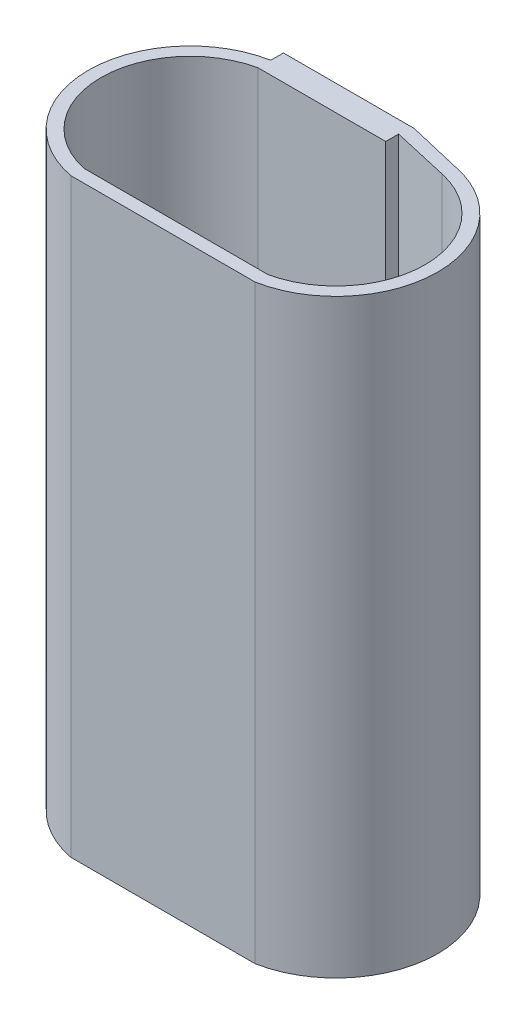
ISO-10303-21;
HEADER;
FILE_DESCRIPTION(('STEP AP214'),'2;1');
FILE_NAME('part.step','',(''),(''),'','','');
FILE_SCHEMA(('AUTOMOTIVE_DESIGN { 1 0 10303 214 1 1 1 1 }'));
ENDSEC;
DATA;
#1=APPLICATION_CONTEXT('core data for automotive mechanical design processes');
#2=APPLICATION_PROTOCOL_DEFINITION('international standard','automotive_design',2000,#1);
#3=PRODUCT_CONTEXT('',#1,'mechanical');
#4=PRODUCT('Part','Part','',(#3));
#5=PRODUCT_RELATED_PRODUCT_CATEGORY('part','',(#4));
#6=PRODUCT_DEFINITION_FORMATION('','',#4);
#7=PRODUCT_DEFINITION_CONTEXT('part definition',#1,'design');
#8=PRODUCT_DEFINITION('design','',#6,#7);
#9=PRODUCT_DEFINITION_SHAPE('','',#8);
#10=(LENGTH_UNIT() NAMED_UNIT(*) SI_UNIT(.MILLI.,.METRE.));
#11=(NAMED_UNIT(*) PLANE_ANGLE_UNIT() SI_UNIT($,.RADIAN.));
#12=(NAMED_UNIT(*) SI_UNIT($,.STERADIAN.) SOLID_ANGLE_UNIT());
#13=UNCERTAINTY_MEASURE_WITH_UNIT(LENGTH_MEASURE(1.E-05),#10,'distance_accuracy_value','');
#14=(GEOMETRIC_REPRESENTATION_CONTEXT(3) GLOBAL_UNCERTAINTY_ASSIGNED_CONTEXT((#13)) GLOBAL_UNIT_ASSIGNED_CONTEXT((#10,
#11,#12)) REPRESENTATION_CONTEXT('',''));
#15=CARTESIAN_POINT('',(0.,0.,0.));
#16=DIRECTION('',(0.,0.,1.));
#17=DIRECTION('',(1.,0.,0.));
#18=AXIS2_PLACEMENT_3D('',#15,#16,#17);
#19=CARTESIAN_POINT('',(0.,70.45,11.9295416164526));
#20=DIRECTION('',(0.,0.,-1.));
#21=DIRECTION('',(-1.,0.,0.));
#22=AXIS2_PLACEMENT_3D('',#19,#20,#21);
#23=PLANE('',#22);
#24=DIRECTION('',(1.,0.,0.));
#25=VECTOR('',#24,1.);
#26=CARTESIAN_POINT('',(0.,0.,11.9295416164526));
#27=LINE('',#26,#25);
#28=CARTESIAN_POINT('',(-10.463385514887,0.,11.9295416164526));
#29=VERTEX_POINT('',#28);
#30=CARTESIAN_POINT('',(11.536614485113,0.,11.9295416164526));
#31=VERTEX_POINT('',#30);
#32=EDGE_CURVE('E174',#29,#31,#27,.T.);
#33=ORIENTED_EDGE('',*,*,#32,.T.);
#34=DIRECTION('',(0.,-1.,0.));
#35=VECTOR('',#34,1.);
#36=CARTESIAN_POINT('',(11.536614485113,70.45,11.9295416164526));
#37=LINE('',#36,#35);
#38=CARTESIAN_POINT('',(11.536614485113,70.45,11.9295416164526));
#39=VERTEX_POINT('',#38);
#40=EDGE_CURVE('E193',#39,#31,#37,.T.);
#41=ORIENTED_EDGE('',*,*,#40,.F.);
#42=DIRECTION('',(1.,0.,0.));
#43=VECTOR('',#42,1.);
#44=CARTESIAN_POINT('',(0.,70.45,11.9295416164526));
#45=LINE('',#44,#43);
#46=CARTESIAN_POINT('',(-10.463385514887,70.45,11.9295416164526));
#47=VERTEX_POINT('',#46);
#48=EDGE_CURVE('E281',#47,#39,#45,.T.);
#49=ORIENTED_EDGE('',*,*,#48,.F.);
#50=DIRECTION('',(0.,-1.,0.));
#51=VECTOR('',#50,1.);
#52=CARTESIAN_POINT('',(-10.463385514887,70.45,11.9295416164526));
#53=LINE('',#52,#51);
#54=EDGE_CURVE('E186',#47,#29,#53,.T.);
#55=ORIENTED_EDGE('',*,*,#54,.T.);
#56=EDGE_LOOP('',(#33,#41,#49,#55));
#57=FACE_BOUND('',#56,.T.);
#58=ADVANCED_FACE('F34',(#57),#23,.F.);
#59=CARTESIAN_POINT('',(9.24161448511298,70.45,0.));
#60=DIRECTION('',(0.,-1.,0.));
#61=DIRECTION('',(0.,0.,-1.));
#62=AXIS2_PLACEMENT_3D('',#59,#60,#61);
#63=CYLINDRICAL_SURFACE('',#62,12.1482915744838);
#64=CARTESIAN_POINT('',(9.24161448511298,0.,0.));
#65=DIRECTION('',(0.,1.,0.));
#66=DIRECTION('',(0.,0.,1.));
#67=AXIS2_PLACEMENT_3D('',#64,#65,#66);
#68=CIRCLE('',#67,12.1482915744838);
#69=CARTESIAN_POINT('',(11.536614485113,0.,-11.9295416164526));
#70=VERTEX_POINT('',#69);
#71=EDGE_CURVE('E177',#31,#70,#68,.T.);
#72=ORIENTED_EDGE('',*,*,#71,.T.);
#73=DIRECTION('',(0.,-1.,0.));
#74=VECTOR('',#73,1.);
#75=CARTESIAN_POINT('',(11.536614485113,70.45,-11.9295416164526));
#76=LINE('',#75,#74);
#77=CARTESIAN_POINT('',(11.536614485113,70.45,-11.9295416164526));
#78=VERTEX_POINT('',#77);
#79=EDGE_CURVE('E191',#78,#70,#76,.T.);
#80=ORIENTED_EDGE('',*,*,#79,.F.);
#81=CARTESIAN_POINT('',(9.24161448511298,70.45,0.));
#82=DIRECTION('',(0.,1.,0.));
#83=DIRECTION('',(0.,0.,1.));
#84=AXIS2_PLACEMENT_3D('',#81,#82,#83);
#85=CIRCLE('',#84,12.1482915744838);
#86=EDGE_CURVE('E152',#39,#78,#85,.T.);
#87=ORIENTED_EDGE('',*,*,#86,.F.);
#88=ORIENTED_EDGE('',*,*,#40,.T.);
#89=EDGE_LOOP('',(#72,#80,#87,#88));
#90=FACE_BOUND('',#89,.T.);
#91=ADVANCED_FACE('F227',(#90),#63,.T.);
#92=CARTESIAN_POINT('',(3.26790151277206,70.45,-13.8767762699066));
#93=DIRECTION('',(0.229223946718848,0.,-0.97337371150583));
#94=DIRECTION('',(-0.97337371150583,0.,-0.229223946718849));
#95=AXIS2_PLACEMENT_3D('',#92,#93,#94);
#96=PLANE('',#95);
#97=DIRECTION('',(0.97337371150583,0.,0.229223946718849));
#98=VECTOR('',#97,1.);
#99=CARTESIAN_POINT('',(3.26790151277206,0.,-13.8767762699066));
#100=LINE('',#99,#98);
#101=CARTESIAN_POINT('',(5.13292491256806,0.,-13.4375739169245));
#102=VERTEX_POINT('',#101);
#103=EDGE_CURVE('E180',#102,#70,#100,.T.);
#104=ORIENTED_EDGE('',*,*,#103,.F.);
#105=DIRECTION('',(0.,-1.,0.));
#106=VECTOR('',#105,1.);
#107=CARTESIAN_POINT('',(5.13292491256806,70.45,-13.4375739169245));
#108=LINE('',#107,#106);
#109=CARTESIAN_POINT('',(5.13292491256806,70.45,-13.4375739169245));
#110=VERTEX_POINT('',#109);
#111=EDGE_CURVE('E141',#110,#102,#108,.T.);
#112=ORIENTED_EDGE('',*,*,#111,.F.);
#113=DIRECTION('',(0.97337371150583,0.,0.229223946718849));
#114=VECTOR('',#113,1.);
#115=CARTESIAN_POINT('',(3.26790151277206,70.45,-13.8767762699066));
#116=LINE('',#115,#114);
#117=EDGE_CURVE('E150',#110,#78,#116,.T.);
#118=ORIENTED_EDGE('',*,*,#117,.T.);
#119=ORIENTED_EDGE('',*,*,#79,.T.);
#120=EDGE_LOOP('',(#104,#112,#118,#119));
#121=FACE_BOUND('',#120,.T.);
#122=ADVANCED_FACE('F222',(#121),#96,.T.);
#123=CARTESIAN_POINT('',(0.,70.45,-13.4375739169245));
#124=DIRECTION('',(0.,0.,-1.));
#125=DIRECTION('',(-1.,0.,0.));
#126=AXIS2_PLACEMENT_3D('',#123,#124,#125);
#127=PLANE('',#126);
#128=DIRECTION('',(1.,0.,0.));
#129=VECTOR('',#128,1.);
#130=CARTESIAN_POINT('',(0.,0.,-13.4375739169245));
#131=LINE('',#130,#129);
#132=CARTESIAN_POINT('',(-10.463385514887,0.,-13.4375739169245));
#133=VERTEX_POINT('',#132);
#134=EDGE_CURVE('E140',#133,#102,#131,.T.);
#135=ORIENTED_EDGE('',*,*,#134,.F.);
#136=DIRECTION('',(0.,-1.,0.));
#137=VECTOR('',#136,1.);
#138=CARTESIAN_POINT('',(-10.463385514887,70.45,-13.4375739169245));
#139=LINE('',#138,#137);
#140=CARTESIAN_POINT('',(-10.463385514887,70.45,-13.4375739169245));
#141=VERTEX_POINT('',#140);
#142=EDGE_CURVE('E134',#141,#133,#139,.T.);
#143=ORIENTED_EDGE('',*,*,#142,.F.);
#144=DIRECTION('',(1.,0.,0.));
#145=VECTOR('',#144,1.);
#146=CARTESIAN_POINT('',(0.,70.45,-13.4375739169245));
#147=LINE('',#146,#145);
#148=EDGE_CURVE('E138',#141,#110,#147,.T.);
#149=ORIENTED_EDGE('',*,*,#148,.T.);
#150=ORIENTED_EDGE('',*,*,#111,.T.);
#151=EDGE_LOOP('',(#135,#143,#149,#150));
#152=FACE_BOUND('',#151,.T.);
#153=ADVANCED_FACE('F136',(#152),#127,.T.);
#154=CARTESIAN_POINT('',(-10.463385514887,70.45,0.));
#155=DIRECTION('',(1.,0.,0.));
#156=DIRECTION('',(0.,0.,-1.));
#157=AXIS2_PLACEMENT_3D('',#154,#155,#156);
#158=PLANE('',#157);
#159=CARTESIAN_POINT('',(-10.463385514887,36.4422418848818,-12.6819068964044));
#160=DIRECTION('',(1.,0.,0.));
#161=DIRECTION('',(0.,0.,-1.));
#162=AXIS2_PLACEMENT_3D('',#159,#160,#161);
#163=CIRCLE('',#162,0.572709313377236);
#164=CARTESIAN_POINT('',(-10.463385514887,36.4422418848818,-13.2546162097816));
#165=VERTEX_POINT('',#164);
#166=EDGE_CURVE('E11',#165,#165,#163,.F.);
#167=ORIENTED_EDGE('',*,*,#166,.F.);
#168=EDGE_LOOP('',(#167));
#169=FACE_BOUND('',#168,.T.);
#170=CARTESIAN_POINT('',(-10.463385514887,34.0138853527279,-12.6819068964044));
#171=DIRECTION('',(1.,0.,0.));
#172=DIRECTION('',(0.,0.,-1.));
#173=AXIS2_PLACEMENT_3D('',#170,#171,#172);
#174=CIRCLE('',#173,0.574746223115068);
#175=CARTESIAN_POINT('',(-10.463385514887,34.0138853527279,-13.2566531195195));
#176=VERTEX_POINT('',#175);
#177=EDGE_CURVE('E43',#176,#176,#174,.F.);
#178=ORIENTED_EDGE('',*,*,#177,.F.);
#179=EDGE_LOOP('',(#178));
#180=FACE_BOUND('',#179,.T.);
#181=DIRECTION('',(0.,0.,1.));
#182=VECTOR('',#181,1.);
#183=CARTESIAN_POINT('',(-10.463385514887,0.,0.));
#184=LINE('',#183,#182);
#185=CARTESIAN_POINT('',(-10.463385514887,0.,-11.9295416164526));
#186=VERTEX_POINT('',#185);
#187=EDGE_CURVE('E91',#133,#186,#184,.T.);
#188=ORIENTED_EDGE('',*,*,#187,.T.);
#189=DIRECTION('',(0.,-1.,0.));
#190=VECTOR('',#189,1.);
#191=CARTESIAN_POINT('',(-10.463385514887,70.45,-11.9295416164526));
#192=LINE('',#191,#190);
#193=CARTESIAN_POINT('',(-10.463385514887,70.45,-11.9295416164526));
#194=VERTEX_POINT('',#193);
#195=EDGE_CURVE('E142',#194,#186,#192,.T.);
#196=ORIENTED_EDGE('',*,*,#195,.F.);
#197=DIRECTION('',(0.,0.,1.));
#198=VECTOR('',#197,1.);
#199=CARTESIAN_POINT('',(-10.463385514887,70.45,0.));
#200=LINE('',#199,#198);
#201=EDGE_CURVE('E144',#141,#194,#200,.T.);
#202=ORIENTED_EDGE('',*,*,#201,.F.);
#203=ORIENTED_EDGE('',*,*,#142,.T.);
#204=EDGE_LOOP('',(#188,#196,#202,#203));
#205=FACE_BOUND('',#204,.T.);
#206=ADVANCED_FACE('F145',(#169,#180,#205),#158,.F.);
#207=CARTESIAN_POINT('',(4.78876070588704,70.45,0.));
#208=DIRECTION('',(-1.,0.,0.));
#209=DIRECTION('',(0.,0.,1.));
#210=AXIS2_PLACEMENT_3D('',#207,#208,#209);
#211=PLANE('',#210);
#212=DIRECTION('',(0.,0.,-1.));
#213=VECTOR('',#212,1.);
#214=CARTESIAN_POINT('',(4.78876070588704,0.,0.));
#215=LINE('',#214,#213);
#216=CARTESIAN_POINT('',(4.78876070588704,0.,-10.3895416164526));
#217=VERTEX_POINT('',#216);
#218=CARTESIAN_POINT('',(4.78876070588704,0.,-11.9295416164526));
#219=VERTEX_POINT('',#218);
#220=EDGE_CURVE('E158',#217,#219,#215,.T.);
#221=ORIENTED_EDGE('',*,*,#220,.T.);
#222=DIRECTION('',(0.,-1.,0.));
#223=VECTOR('',#222,1.);
#224=CARTESIAN_POINT('',(4.78876070588704,70.45,-11.9295416164526));
#225=LINE('',#224,#223);
#226=CARTESIAN_POINT('',(4.78876070588704,70.45,-11.9295416164526));
#227=VERTEX_POINT('',#226);
#228=EDGE_CURVE('E188',#227,#219,#225,.T.);
#229=ORIENTED_EDGE('',*,*,#228,.F.);
#230=DIRECTION('',(0.,0.,-1.));
#231=VECTOR('',#230,1.);
#232=CARTESIAN_POINT('',(4.78876070588704,70.45,0.));
#233=LINE('',#232,#231);
#234=CARTESIAN_POINT('',(4.78876070588704,70.45,-10.3895416164526));
#235=VERTEX_POINT('',#234);
#236=EDGE_CURVE('E106',#235,#227,#233,.T.);
#237=ORIENTED_EDGE('',*,*,#236,.F.);
#238=DIRECTION('',(0.,-1.,0.));
#239=VECTOR('',#238,1.);
#240=CARTESIAN_POINT('',(4.78876070588704,70.45,-10.3895416164526));
#241=LINE('',#240,#239);
#242=EDGE_CURVE('E157',#235,#217,#241,.T.);
#243=ORIENTED_EDGE('',*,*,#242,.T.);
#244=EDGE_LOOP('',(#221,#229,#237,#243));
#245=FACE_BOUND('',#244,.T.);
#246=ADVANCED_FACE('F36',(#245),#211,.F.);
#247=CARTESIAN_POINT('',(2.82485777500252,70.45,-12.3777449433938));
#248=DIRECTION('',(-0.222499841773163,0.,0.974932726094943));
#249=DIRECTION('',(0.974932726094943,0.,0.222499841773163));
#250=AXIS2_PLACEMENT_3D('',#247,#248,#249);
#251=PLANE('',#250);
#252=DIRECTION('',(-0.974932726094943,0.,-0.222499841773163));
#253=VECTOR('',#252,1.);
#254=CARTESIAN_POINT('',(2.82485777500252,0.,-12.3777449433938));
#255=LINE('',#254,#253);
#256=CARTESIAN_POINT('',(11.536614485113,0.,-10.3895416164526));
#257=VERTEX_POINT('',#256);
#258=EDGE_CURVE('E161',#257,#219,#255,.T.);
#259=ORIENTED_EDGE('',*,*,#258,.F.);
#260=DIRECTION('',(0.,-1.,0.));
#261=VECTOR('',#260,1.);
#262=CARTESIAN_POINT('',(11.536614485113,70.45,-10.3895416164526));
#263=LINE('',#262,#261);
#264=CARTESIAN_POINT('',(11.536614485113,70.45,-10.3895416164526));
#265=VERTEX_POINT('',#264);
#266=EDGE_CURVE('E206',#265,#257,#263,.T.);
#267=ORIENTED_EDGE('',*,*,#266,.F.);
#268=DIRECTION('',(-0.974932726094943,0.,-0.222499841773163));
#269=VECTOR('',#268,1.);
#270=CARTESIAN_POINT('',(2.82485777500252,70.45,-12.3777449433938));
#271=LINE('',#270,#269);
#272=EDGE_CURVE('E271',#265,#227,#271,.T.);
#273=ORIENTED_EDGE('',*,*,#272,.T.);
#274=ORIENTED_EDGE('',*,*,#228,.T.);
#275=EDGE_LOOP('',(#259,#267,#273,#274));
#276=FACE_BOUND('',#275,.T.);
#277=ADVANCED_FACE('F220',(#276),#251,.T.);
#278=CARTESIAN_POINT('',(9.24161448511298,70.45,0.));
#279=DIRECTION('',(0.,-1.,0.));
#280=DIRECTION('',(0.,0.,-1.));
#281=AXIS2_PLACEMENT_3D('',#278,#279,#280);
#282=CYLINDRICAL_SURFACE('',#281,10.64);
#283=CARTESIAN_POINT('',(9.24161448511298,0.,0.));
#284=DIRECTION('',(0.,1.,0.));
#285=DIRECTION('',(0.,0.,1.));
#286=AXIS2_PLACEMENT_3D('',#283,#284,#285);
#287=CIRCLE('',#286,10.64);
#288=CARTESIAN_POINT('',(11.536614485113,0.,10.3895416164526));
#289=VERTEX_POINT('',#288);
#290=EDGE_CURVE('E165',#289,#257,#287,.T.);
#291=ORIENTED_EDGE('',*,*,#290,.F.);
#292=DIRECTION('',(0.,-1.,0.));
#293=VECTOR('',#292,1.);
#294=CARTESIAN_POINT('',(11.536614485113,70.45,10.3895416164526));
#295=LINE('',#294,#293);
#296=CARTESIAN_POINT('',(11.536614485113,70.45,10.3895416164526));
#297=VERTEX_POINT('',#296);
#298=EDGE_CURVE('E204',#297,#289,#295,.T.);
#299=ORIENTED_EDGE('',*,*,#298,.F.);
#300=CARTESIAN_POINT('',(9.24161448511298,70.45,0.));
#301=DIRECTION('',(0.,1.,0.));
#302=DIRECTION('',(0.,0.,1.));
#303=AXIS2_PLACEMENT_3D('',#300,#301,#302);
#304=CIRCLE('',#303,10.64);
#305=EDGE_CURVE('E269',#297,#265,#304,.T.);
#306=ORIENTED_EDGE('',*,*,#305,.T.);
#307=ORIENTED_EDGE('',*,*,#266,.T.);
#308=EDGE_LOOP('',(#291,#299,#306,#307));
#309=FACE_BOUND('',#308,.T.);
#310=ADVANCED_FACE('F249',(#309),#282,.F.);
#311=CARTESIAN_POINT('',(0.,70.45,10.3895416164526));
#312=DIRECTION('',(0.,0.,1.));
#313=DIRECTION('',(1.,0.,0.));
#314=AXIS2_PLACEMENT_3D('',#311,#312,#313);
#315=PLANE('',#314);
#316=DIRECTION('',(-1.,0.,0.));
#317=VECTOR('',#316,1.);
#318=CARTESIAN_POINT('',(0.,0.,10.3895416164526));
#319=LINE('',#318,#317);
#320=CARTESIAN_POINT('',(-10.463385514887,0.,10.3895416164526));
#321=VERTEX_POINT('',#320);
#322=EDGE_CURVE('E168',#289,#321,#319,.T.);
#323=ORIENTED_EDGE('',*,*,#322,.T.);
#324=DIRECTION('',(0.,-1.,0.));
#325=VECTOR('',#324,1.);
#326=CARTESIAN_POINT('',(-10.463385514887,70.45,10.3895416164526));
#327=LINE('',#326,#325);
#328=CARTESIAN_POINT('',(-10.463385514887,70.45,10.3895416164526));
#329=VERTEX_POINT('',#328);
#330=EDGE_CURVE('E201',#329,#321,#327,.T.);
#331=ORIENTED_EDGE('',*,*,#330,.F.);
#332=DIRECTION('',(-1.,0.,0.));
#333=VECTOR('',#332,1.);
#334=CARTESIAN_POINT('',(0.,70.45,10.3895416164526));
#335=LINE('',#334,#333);
#336=EDGE_CURVE('E270',#297,#329,#335,.T.);
#337=ORIENTED_EDGE('',*,*,#336,.F.);
#338=ORIENTED_EDGE('',*,*,#298,.T.);
#339=EDGE_LOOP('',(#323,#331,#337,#338));
#340=FACE_BOUND('',#339,.T.);
#341=ADVANCED_FACE('F245',(#340),#315,.F.);
#342=CARTESIAN_POINT('',(-8.16838551488702,70.45,0.));
#343=DIRECTION('',(0.,-1.,0.));
#344=DIRECTION('',(0.,0.,-1.));
#345=AXIS2_PLACEMENT_3D('',#342,#343,#344);
#346=CYLINDRICAL_SURFACE('',#345,10.64);
#347=CARTESIAN_POINT('',(-8.16838551488702,0.,0.));
#348=DIRECTION('',(0.,1.,0.));
#349=DIRECTION('',(0.,0.,1.));
#350=AXIS2_PLACEMENT_3D('',#347,#348,#349);
#351=CIRCLE('',#350,10.64);
#352=CARTESIAN_POINT('',(-10.463385514887,0.,-10.3895416164526));
#353=VERTEX_POINT('',#352);
#354=EDGE_CURVE('E170',#321,#353,#351,.F.);
#355=ORIENTED_EDGE('',*,*,#354,.T.);
#356=DIRECTION('',(0.,-1.,0.));
#357=VECTOR('',#356,1.);
#358=CARTESIAN_POINT('',(-10.463385514887,70.45,-10.3895416164526));
#359=LINE('',#358,#357);
#360=CARTESIAN_POINT('',(-10.463385514887,70.45,-10.3895416164526));
#361=VERTEX_POINT('',#360);
#362=EDGE_CURVE('E198',#361,#353,#359,.T.);
#363=ORIENTED_EDGE('',*,*,#362,.F.);
#364=CARTESIAN_POINT('',(-8.16838551488702,70.45,0.));
#365=DIRECTION('',(0.,1.,0.));
#366=DIRECTION('',(0.,0.,1.));
#367=AXIS2_PLACEMENT_3D('',#364,#365,#366);
#368=CIRCLE('',#367,10.64);
#369=EDGE_CURVE('E273',#329,#361,#368,.F.);
#370=ORIENTED_EDGE('',*,*,#369,.F.);
#371=ORIENTED_EDGE('',*,*,#330,.T.);
#372=EDGE_LOOP('',(#355,#363,#370,#371));
#373=FACE_BOUND('',#372,.T.);
#374=ADVANCED_FACE('F241',(#373),#346,.F.);
#375=CARTESIAN_POINT('',(0.,70.45,-10.3895416164526));
#376=DIRECTION('',(0.,0.,-1.));
#377=DIRECTION('',(-1.,0.,0.));
#378=AXIS2_PLACEMENT_3D('',#375,#376,#377);
#379=PLANE('',#378);
#380=DIRECTION('',(1.,0.,0.));
#381=VECTOR('',#380,1.);
#382=CARTESIAN_POINT('',(0.,0.,-10.3895416164526));
#383=LINE('',#382,#381);
#384=EDGE_CURVE('E172',#353,#217,#383,.T.);
#385=ORIENTED_EDGE('',*,*,#384,.T.);
#386=ORIENTED_EDGE('',*,*,#242,.F.);
#387=DIRECTION('',(1.,0.,0.));
#388=VECTOR('',#387,1.);
#389=CARTESIAN_POINT('',(0.,70.45,-10.3895416164526));
#390=LINE('',#389,#388);
#391=EDGE_CURVE('E279',#361,#235,#390,.T.);
#392=ORIENTED_EDGE('',*,*,#391,.F.);
#393=ORIENTED_EDGE('',*,*,#362,.T.);
#394=EDGE_LOOP('',(#385,#386,#392,#393));
#395=FACE_BOUND('',#394,.T.);
#396=ADVANCED_FACE('F237',(#395),#379,.F.);
#397=CARTESIAN_POINT('',(-8.16838551488702,70.45,0.));
#398=DIRECTION('',(0.,-1.,0.));
#399=DIRECTION('',(0.,0.,-1.));
#400=AXIS2_PLACEMENT_3D('',#397,#398,#399);
#401=CYLINDRICAL_SURFACE('',#400,12.1482915744838);
#402=CARTESIAN_POINT('',(-8.16838551488702,0.,0.));
#403=DIRECTION('',(0.,1.,0.));
#404=DIRECTION('',(0.,0.,1.));
#405=AXIS2_PLACEMENT_3D('',#402,#403,#404);
#406=CIRCLE('',#405,12.1482915744838);
#407=EDGE_CURVE('E97',#186,#29,#406,.T.);
#408=ORIENTED_EDGE('',*,*,#407,.T.);
#409=ORIENTED_EDGE('',*,*,#54,.F.);
#410=CARTESIAN_POINT('',(-8.16838551488702,70.45,0.));
#411=DIRECTION('',(0.,1.,0.));
#412=DIRECTION('',(0.,0.,1.));
#413=AXIS2_PLACEMENT_3D('',#410,#411,#412);
#414=CIRCLE('',#413,12.1482915744838);
#415=EDGE_CURVE('E51',#194,#47,#414,.T.);
#416=ORIENTED_EDGE('',*,*,#415,.F.);
#417=ORIENTED_EDGE('',*,*,#195,.T.);
#418=EDGE_LOOP('',(#408,#409,#416,#417));
#419=FACE_BOUND('',#418,.T.);
#420=ADVANCED_FACE('F240',(#419),#401,.T.);
#421=CARTESIAN_POINT('',(0.,70.45,0.));
#422=DIRECTION('',(0.,1.,0.));
#423=DIRECTION('',(0.,0.,1.));
#424=AXIS2_PLACEMENT_3D('',#421,#422,#423);
#425=PLANE('',#424);
#426=ORIENTED_EDGE('',*,*,#236,.T.);
#427=ORIENTED_EDGE('',*,*,#272,.F.);
#428=ORIENTED_EDGE('',*,*,#305,.F.);
#429=ORIENTED_EDGE('',*,*,#336,.T.);
#430=ORIENTED_EDGE('',*,*,#369,.T.);
#431=ORIENTED_EDGE('',*,*,#391,.T.);
#432=EDGE_LOOP('',(#426,#427,#428,#429,#430,#431));
#433=FACE_BOUND('',#432,.T.);
#434=ORIENTED_EDGE('',*,*,#48,.T.);
#435=ORIENTED_EDGE('',*,*,#86,.T.);
#436=ORIENTED_EDGE('',*,*,#117,.F.);
#437=ORIENTED_EDGE('',*,*,#148,.F.);
#438=ORIENTED_EDGE('',*,*,#201,.T.);
#439=ORIENTED_EDGE('',*,*,#415,.T.);
#440=EDGE_LOOP('',(#434,#435,#436,#437,#438,#439));
#441=FACE_BOUND('',#440,.T.);
#442=ADVANCED_FACE('F148',(#433,#441),#425,.T.);
#443=CARTESIAN_POINT('',(0.,0.,0.));
#444=DIRECTION('',(0.,1.,0.));
#445=DIRECTION('',(0.,0.,1.));
#446=AXIS2_PLACEMENT_3D('',#443,#444,#445);
#447=PLANE('',#446);
#448=ORIENTED_EDGE('',*,*,#220,.F.);
#449=ORIENTED_EDGE('',*,*,#384,.F.);
#450=ORIENTED_EDGE('',*,*,#354,.F.);
#451=ORIENTED_EDGE('',*,*,#322,.F.);
#452=ORIENTED_EDGE('',*,*,#290,.T.);
#453=ORIENTED_EDGE('',*,*,#258,.T.);
#454=EDGE_LOOP('',(#448,#449,#450,#451,#452,#453));
#455=FACE_BOUND('',#454,.T.);
#456=ORIENTED_EDGE('',*,*,#32,.F.);
#457=ORIENTED_EDGE('',*,*,#407,.F.);
#458=ORIENTED_EDGE('',*,*,#187,.F.);
#459=ORIENTED_EDGE('',*,*,#134,.T.);
#460=ORIENTED_EDGE('',*,*,#103,.T.);
#461=ORIENTED_EDGE('',*,*,#71,.F.);
#462=EDGE_LOOP('',(#456,#457,#458,#459,#460,#461));
#463=FACE_BOUND('',#462,.T.);
#464=ADVANCED_FACE('F263',(#455,#463),#447,.F.);
#465=CARTESIAN_POINT('',(-12.463385514887,34.0138853527279,-12.6819068964044));
#466=DIRECTION('',(1.,0.,0.));
#467=DIRECTION('',(0.,0.,-1.));
#468=AXIS2_PLACEMENT_3D('',#465,#466,#467);
#469=CYLINDRICAL_SURFACE('',#468,0.574746223115068);
#470=CARTESIAN_POINT('',(-12.463385514887,34.0138853527279,-12.6819068964044));
#471=DIRECTION('',(-1.,0.,0.));
#472=DIRECTION('',(0.,0.,1.));
#473=AXIS2_PLACEMENT_3D('',#470,#471,#472);
#474=CIRCLE('',#473,0.574746223115068);
#475=CARTESIAN_POINT('',(-12.463385514887,34.0138853527279,-12.1071606732893));
#476=VERTEX_POINT('',#475);
#477=EDGE_CURVE('E162',#476,#476,#474,.T.);
#478=ORIENTED_EDGE('',*,*,#477,.F.);
#479=EDGE_LOOP('',(#478));
#480=FACE_BOUND('',#479,.T.);
#481=ORIENTED_EDGE('',*,*,#177,.T.);
#482=EDGE_LOOP('',(#481));
#483=FACE_BOUND('',#482,.T.);
#484=ADVANCED_FACE('F211',(#480,#483),#469,.T.);
#485=CARTESIAN_POINT('',(-12.463385514887,34.0138853527279,-12.6819068964044));
#486=DIRECTION('',(-1.,0.,0.));
#487=DIRECTION('',(0.,0.,1.));
#488=AXIS2_PLACEMENT_3D('',#485,#486,#487);
#489=PLANE('',#488);
#490=ORIENTED_EDGE('',*,*,#477,.T.);
#491=EDGE_LOOP('',(#490));
#492=FACE_BOUND('',#491,.T.);
#493=ADVANCED_FACE('F298',(#492),#489,.T.);
#494=CARTESIAN_POINT('',(-12.463385514887,36.4422418848818,-12.6819068964044));
#495=DIRECTION('',(1.,0.,0.));
#496=DIRECTION('',(0.,0.,-1.));
#497=AXIS2_PLACEMENT_3D('',#494,#495,#496);
#498=CYLINDRICAL_SURFACE('',#497,0.572709313377236);
#499=CARTESIAN_POINT('',(-12.463385514887,36.4422418848818,-12.6819068964044));
#500=DIRECTION('',(-1.,0.,0.));
#501=DIRECTION('',(0.,0.,1.));
#502=AXIS2_PLACEMENT_3D('',#499,#500,#501);
#503=CIRCLE('',#502,0.572709313377236);
#504=CARTESIAN_POINT('',(-12.463385514887,36.4422418848818,-12.1091975830272));
#505=VERTEX_POINT('',#504);
#506=EDGE_CURVE('E314',#505,#505,#503,.T.);
#507=ORIENTED_EDGE('',*,*,#506,.F.);
#508=EDGE_LOOP('',(#507));
#509=FACE_BOUND('',#508,.T.);
#510=ORIENTED_EDGE('',*,*,#166,.T.);
#511=EDGE_LOOP('',(#510));
#512=FACE_BOUND('',#511,.T.);
#513=ADVANCED_FACE('F302',(#509,#512),#498,.T.);
#514=CARTESIAN_POINT('',(-12.463385514887,36.4422418848818,-12.6819068964044));
#515=DIRECTION('',(-1.,0.,0.));
#516=DIRECTION('',(0.,0.,1.));
#517=AXIS2_PLACEMENT_3D('',#514,#515,#516);
#518=PLANE('',#517);
#519=ORIENTED_EDGE('',*,*,#506,.T.);
#520=EDGE_LOOP('',(#519));
#521=FACE_BOUND('',#520,.T.);
#522=ADVANCED_FACE('F306',(#521),#518,.T.);
#523=CLOSED_SHELL('',(#58,#91,#122,#153,#206,#246,#277,#310,#341,#374,#396,#420,#442,#464,#484,
#493,#513,#522));
#524=MANIFOLD_SOLID_BREP('B2',#523);
#525=ADVANCED_BREP_SHAPE_REPRESENTATION('',(#18,#524),#14);
#526=SHAPE_DEFINITION_REPRESENTATION(#9,#525);
ENDSEC;
END-ISO-10303-21;
